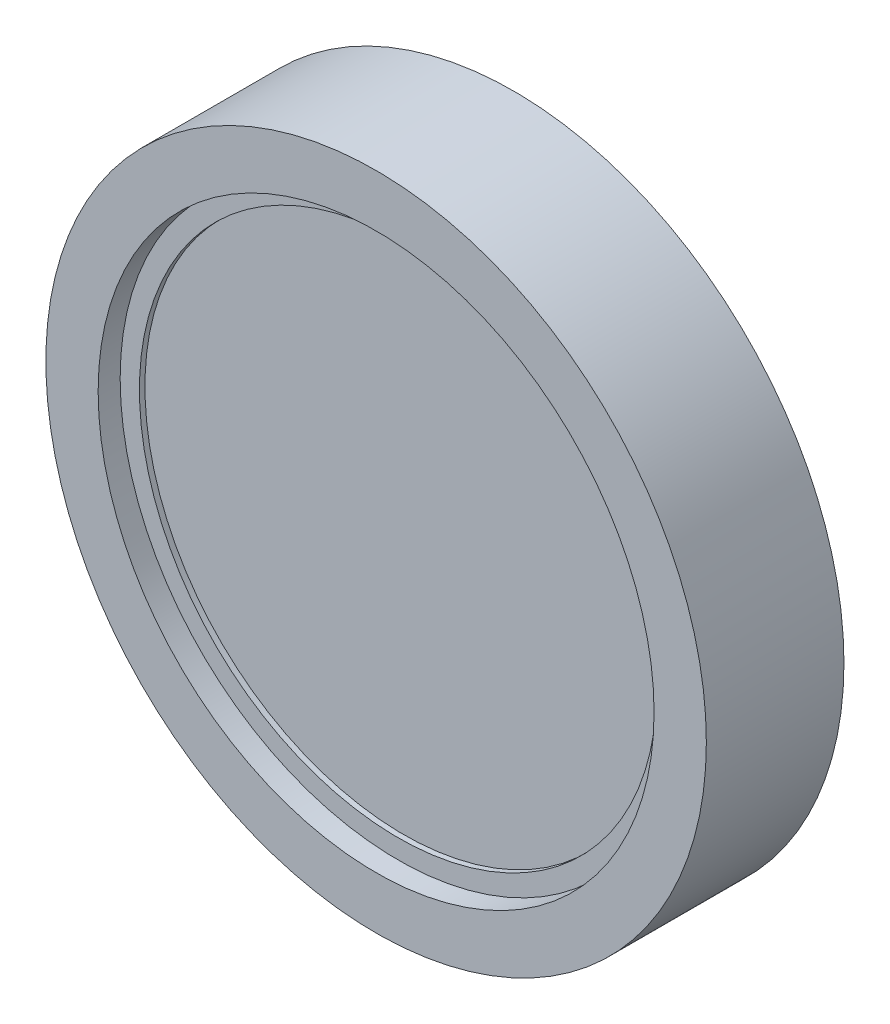
ISO-10303-21;
HEADER;
FILE_DESCRIPTION(('STEP AP214'),'2;1');
FILE_NAME('part.step','',(''),(''),'','','');
FILE_SCHEMA(('AUTOMOTIVE_DESIGN { 1 0 10303 214 1 1 1 1 }'));
ENDSEC;
DATA;
#1=APPLICATION_CONTEXT('core data for automotive mechanical design processes');
#2=APPLICATION_PROTOCOL_DEFINITION('international standard','automotive_design',2000,#1);
#3=PRODUCT_CONTEXT('',#1,'mechanical');
#4=PRODUCT('Part','Part','',(#3));
#5=PRODUCT_RELATED_PRODUCT_CATEGORY('part','',(#4));
#6=PRODUCT_DEFINITION_FORMATION('','',#4);
#7=PRODUCT_DEFINITION_CONTEXT('part definition',#1,'design');
#8=PRODUCT_DEFINITION('design','',#6,#7);
#9=PRODUCT_DEFINITION_SHAPE('','',#8);
#10=(LENGTH_UNIT() NAMED_UNIT(*) SI_UNIT(.MILLI.,.METRE.));
#11=(NAMED_UNIT(*) PLANE_ANGLE_UNIT() SI_UNIT($,.RADIAN.));
#12=(NAMED_UNIT(*) SI_UNIT($,.STERADIAN.) SOLID_ANGLE_UNIT());
#13=UNCERTAINTY_MEASURE_WITH_UNIT(LENGTH_MEASURE(1.E-05),#10,'distance_accuracy_value','');
#14=(GEOMETRIC_REPRESENTATION_CONTEXT(3) GLOBAL_UNCERTAINTY_ASSIGNED_CONTEXT((#13)) GLOBAL_UNIT_ASSIGNED_CONTEXT((#10,
#11,#12)) REPRESENTATION_CONTEXT('',''));
#15=CARTESIAN_POINT('',(0.,0.,0.));
#16=DIRECTION('',(0.,0.,1.));
#17=DIRECTION('',(1.,0.,0.));
#18=AXIS2_PLACEMENT_3D('',#15,#16,#17);
#19=CARTESIAN_POINT('',(0.,0.,-6.35));
#20=DIRECTION('',(0.,0.,1.));
#21=DIRECTION('',(1.,0.,0.));
#22=AXIS2_PLACEMENT_3D('',#19,#20,#21);
#23=CYLINDRICAL_SURFACE('',#22,15.24);
#24=CARTESIAN_POINT('',(0.,0.,-6.35));
#25=DIRECTION('',(0.,0.,1.));
#26=DIRECTION('',(1.,0.,0.));
#27=AXIS2_PLACEMENT_3D('',#24,#25,#26);
#28=CIRCLE('',#27,15.24);
#29=CARTESIAN_POINT('',(15.24,0.,-6.35));
#30=VERTEX_POINT('',#29);
#31=EDGE_CURVE('E10',#30,#30,#28,.T.);
#32=ORIENTED_EDGE('',*,*,#31,.T.);
#33=EDGE_LOOP('',(#32));
#34=FACE_BOUND('',#33,.T.);
#35=CARTESIAN_POINT('',(0.,0.,0.));
#36=DIRECTION('',(0.,0.,1.));
#37=DIRECTION('',(1.,0.,0.));
#38=AXIS2_PLACEMENT_3D('',#35,#36,#37);
#39=CIRCLE('',#38,15.24);
#40=CARTESIAN_POINT('',(15.24,0.,0.));
#41=VERTEX_POINT('',#40);
#42=EDGE_CURVE('E45',#41,#41,#39,.T.);
#43=ORIENTED_EDGE('',*,*,#42,.F.);
#44=EDGE_LOOP('',(#43));
#45=FACE_BOUND('',#44,.T.);
#46=ADVANCED_FACE('F37',(#34,#45),#23,.T.);
#47=CARTESIAN_POINT('',(0.,0.,-6.35));
#48=DIRECTION('',(0.,0.,1.));
#49=DIRECTION('',(1.,0.,0.));
#50=AXIS2_PLACEMENT_3D('',#47,#48,#49);
#51=PLANE('',#50);
#52=CARTESIAN_POINT('',(0.,0.,-6.35));
#53=DIRECTION('',(0.,0.,-1.));
#54=DIRECTION('',(-1.,0.,0.));
#55=AXIS2_PLACEMENT_3D('',#52,#53,#54);
#56=CIRCLE('',#55,4.7625);
#57=CARTESIAN_POINT('',(-4.7625,0.,-6.35));
#58=VERTEX_POINT('',#57);
#59=EDGE_CURVE('E65',#58,#58,#56,.T.);
#60=ORIENTED_EDGE('',*,*,#59,.F.);
#61=EDGE_LOOP('',(#60));
#62=FACE_BOUND('',#61,.T.);
#63=ORIENTED_EDGE('',*,*,#31,.F.);
#64=EDGE_LOOP('',(#63));
#65=FACE_BOUND('',#64,.T.);
#66=ADVANCED_FACE('F82',(#62,#65),#51,.F.);
#67=CARTESIAN_POINT('',(0.,0.,0.));
#68=DIRECTION('',(0.,0.,1.));
#69=DIRECTION('',(1.,0.,0.));
#70=AXIS2_PLACEMENT_3D('',#67,#68,#69);
#71=PLANE('',#70);
#72=CARTESIAN_POINT('',(0.,0.,0.));
#73=DIRECTION('',(0.,0.,1.));
#74=DIRECTION('',(1.,0.,0.));
#75=AXIS2_PLACEMENT_3D('',#72,#73,#74);
#76=CIRCLE('',#75,12.827);
#77=CARTESIAN_POINT('',(12.827,0.,0.));
#78=VERTEX_POINT('',#77);
#79=EDGE_CURVE('E56',#78,#78,#76,.T.);
#80=ORIENTED_EDGE('',*,*,#79,.F.);
#81=EDGE_LOOP('',(#80));
#82=FACE_BOUND('',#81,.T.);
#83=ORIENTED_EDGE('',*,*,#42,.T.);
#84=EDGE_LOOP('',(#83));
#85=FACE_BOUND('',#84,.T.);
#86=ADVANCED_FACE('F85',(#82,#85),#71,.T.);
#87=CARTESIAN_POINT('',(0.,0.,-1.016));
#88=DIRECTION('',(0.,0.,1.));
#89=DIRECTION('',(1.,0.,0.));
#90=AXIS2_PLACEMENT_3D('',#87,#88,#89);
#91=PLANE('',#90);
#92=CARTESIAN_POINT('',(0.,0.,-1.016));
#93=DIRECTION('',(0.,0.,1.));
#94=DIRECTION('',(1.,0.,0.));
#95=AXIS2_PLACEMENT_3D('',#92,#93,#94);
#96=CIRCLE('',#95,12.827);
#97=CARTESIAN_POINT('',(12.827,0.,-1.016));
#98=VERTEX_POINT('',#97);
#99=EDGE_CURVE('E60',#98,#98,#96,.T.);
#100=ORIENTED_EDGE('',*,*,#99,.T.);
#101=EDGE_LOOP('',(#100));
#102=FACE_BOUND('',#101,.T.);
#103=CARTESIAN_POINT('',(0.,0.,-1.016));
#104=DIRECTION('',(0.,0.,1.));
#105=DIRECTION('',(1.,0.,0.));
#106=AXIS2_PLACEMENT_3D('',#103,#104,#105);
#107=CIRCLE('',#106,11.938);
#108=CARTESIAN_POINT('',(11.938,0.,-1.016));
#109=VERTEX_POINT('',#108);
#110=EDGE_CURVE('E40',#109,#109,#107,.F.);
#111=ORIENTED_EDGE('',*,*,#110,.T.);
#112=EDGE_LOOP('',(#111));
#113=FACE_BOUND('',#112,.T.);
#114=ADVANCED_FACE('F91',(#102,#113),#91,.T.);
#115=CARTESIAN_POINT('',(0.,0.,-1.016));
#116=DIRECTION('',(0.,0.,1.));
#117=DIRECTION('',(1.,0.,0.));
#118=AXIS2_PLACEMENT_3D('',#115,#116,#117);
#119=CYLINDRICAL_SURFACE('',#118,12.827);
#120=ORIENTED_EDGE('',*,*,#99,.F.);
#121=EDGE_LOOP('',(#120));
#122=FACE_BOUND('',#121,.T.);
#123=ORIENTED_EDGE('',*,*,#79,.T.);
#124=EDGE_LOOP('',(#123));
#125=FACE_BOUND('',#124,.T.);
#126=ADVANCED_FACE('F100',(#122,#125),#119,.F.);
#127=CARTESIAN_POINT('',(0.,0.,-1.27));
#128=DIRECTION('',(0.,0.,1.));
#129=DIRECTION('',(1.,0.,0.));
#130=AXIS2_PLACEMENT_3D('',#127,#128,#129);
#131=PLANE('',#130);
#132=CARTESIAN_POINT('',(0.,0.,-1.27));
#133=DIRECTION('',(0.,0.,1.));
#134=DIRECTION('',(1.,0.,0.));
#135=AXIS2_PLACEMENT_3D('',#132,#133,#134);
#136=CIRCLE('',#135,11.938);
#137=CARTESIAN_POINT('',(11.938,0.,-1.27));
#138=VERTEX_POINT('',#137);
#139=EDGE_CURVE('E51',#138,#138,#136,.T.);
#140=ORIENTED_EDGE('',*,*,#139,.T.);
#141=EDGE_LOOP('',(#140));
#142=FACE_BOUND('',#141,.T.);
#143=ADVANCED_FACE('F96',(#142),#131,.T.);
#144=CARTESIAN_POINT('',(0.,0.,-1.27));
#145=DIRECTION('',(0.,0.,1.));
#146=DIRECTION('',(1.,0.,0.));
#147=AXIS2_PLACEMENT_3D('',#144,#145,#146);
#148=CYLINDRICAL_SURFACE('',#147,11.938);
#149=ORIENTED_EDGE('',*,*,#139,.F.);
#150=EDGE_LOOP('',(#149));
#151=FACE_BOUND('',#150,.T.);
#152=ORIENTED_EDGE('',*,*,#110,.F.);
#153=EDGE_LOOP('',(#152));
#154=FACE_BOUND('',#153,.T.);
#155=ADVANCED_FACE('F78',(#151,#154),#148,.F.);
#156=CARTESIAN_POINT('',(0.,0.,-3.175));
#157=DIRECTION('',(0.,0.,-1.));
#158=DIRECTION('',(-1.,0.,0.));
#159=AXIS2_PLACEMENT_3D('',#156,#157,#158);
#160=CYLINDRICAL_SURFACE('',#159,4.7625);
#161=CARTESIAN_POINT('',(0.,0.,-3.175));
#162=DIRECTION('',(0.,0.,-1.));
#163=DIRECTION('',(-1.,0.,0.));
#164=AXIS2_PLACEMENT_3D('',#161,#162,#163);
#165=CIRCLE('',#164,4.7625);
#166=CARTESIAN_POINT('',(-4.7625,0.,-3.175));
#167=VERTEX_POINT('',#166);
#168=EDGE_CURVE('E61',#167,#167,#165,.T.);
#169=ORIENTED_EDGE('',*,*,#168,.F.);
#170=EDGE_LOOP('',(#169));
#171=FACE_BOUND('',#170,.T.);
#172=ORIENTED_EDGE('',*,*,#59,.T.);
#173=EDGE_LOOP('',(#172));
#174=FACE_BOUND('',#173,.T.);
#175=ADVANCED_FACE('F75',(#171,#174),#160,.F.);
#176=CARTESIAN_POINT('',(0.,0.,-3.175));
#177=DIRECTION('',(0.,0.,-1.));
#178=DIRECTION('',(-1.,0.,0.));
#179=AXIS2_PLACEMENT_3D('',#176,#177,#178);
#180=PLANE('',#179);
#181=ORIENTED_EDGE('',*,*,#168,.T.);
#182=EDGE_LOOP('',(#181));
#183=FACE_BOUND('',#182,.T.);
#184=ADVANCED_FACE('F73',(#183),#180,.T.);
#185=CLOSED_SHELL('',(#46,#66,#86,#114,#126,#143,#155,#175,#184));
#186=MANIFOLD_SOLID_BREP('B2',#185);
#187=ADVANCED_BREP_SHAPE_REPRESENTATION('',(#18,#186),#14);
#188=SHAPE_DEFINITION_REPRESENTATION(#9,#187);
ENDSEC;
END-ISO-10303-21;
